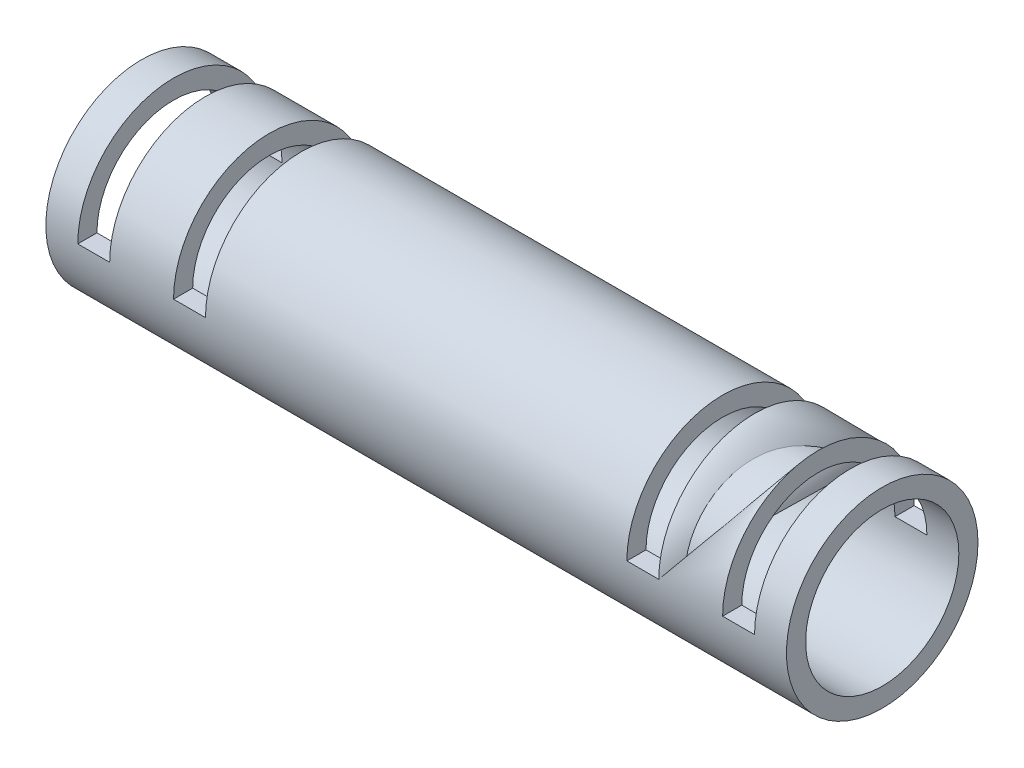
ISO-10303-21;
HEADER;
FILE_DESCRIPTION(('STEP AP214'),'2;1');
FILE_NAME('part.step','',(''),(''),'','','');
FILE_SCHEMA(('AUTOMOTIVE_DESIGN { 1 0 10303 214 1 1 1 1 }'));
ENDSEC;
DATA;
#1=APPLICATION_CONTEXT('core data for automotive mechanical design processes');
#2=APPLICATION_PROTOCOL_DEFINITION('international standard','automotive_design',2000,#1);
#3=PRODUCT_CONTEXT('',#1,'mechanical');
#4=PRODUCT('Part','Part','',(#3));
#5=PRODUCT_RELATED_PRODUCT_CATEGORY('part','',(#4));
#6=PRODUCT_DEFINITION_FORMATION('','',#4);
#7=PRODUCT_DEFINITION_CONTEXT('part definition',#1,'design');
#8=PRODUCT_DEFINITION('design','',#6,#7);
#9=PRODUCT_DEFINITION_SHAPE('','',#8);
#10=(LENGTH_UNIT() NAMED_UNIT(*) SI_UNIT(.MILLI.,.METRE.));
#11=(NAMED_UNIT(*) PLANE_ANGLE_UNIT() SI_UNIT($,.RADIAN.));
#12=(NAMED_UNIT(*) SI_UNIT($,.STERADIAN.) SOLID_ANGLE_UNIT());
#13=UNCERTAINTY_MEASURE_WITH_UNIT(LENGTH_MEASURE(1.E-05),#10,'distance_accuracy_value','');
#14=(GEOMETRIC_REPRESENTATION_CONTEXT(3) GLOBAL_UNCERTAINTY_ASSIGNED_CONTEXT((#13)) GLOBAL_UNIT_ASSIGNED_CONTEXT((#10,
#11,#12)) REPRESENTATION_CONTEXT('',''));
#15=CARTESIAN_POINT('',(0.,0.,0.));
#16=DIRECTION('',(0.,0.,1.));
#17=DIRECTION('',(1.,0.,0.));
#18=AXIS2_PLACEMENT_3D('',#15,#16,#17);
#19=CARTESIAN_POINT('',(29.,0.,0.));
#20=DIRECTION('',(-1.,0.,0.));
#21=DIRECTION('',(0.,0.,1.));
#22=AXIS2_PLACEMENT_3D('',#19,#20,#21);
#23=CYLINDRICAL_SURFACE('',#22,7.5);
#24=CARTESIAN_POINT('',(26.5,0.,0.));
#25=DIRECTION('',(-1.,0.,0.));
#26=DIRECTION('',(0.,0.,1.));
#27=AXIS2_PLACEMENT_3D('',#24,#25,#26);
#28=CIRCLE('',#27,7.5);
#29=CARTESIAN_POINT('',(26.5,0.,-7.5));
#30=VERTEX_POINT('',#29);
#31=CARTESIAN_POINT('',(26.5,0.,7.5));
#32=VERTEX_POINT('',#31);
#33=EDGE_CURVE('E56',#30,#32,#28,.F.);
#34=ORIENTED_EDGE('',*,*,#33,.T.);
#35=DIRECTION('',(1.,0.,0.));
#36=VECTOR('',#35,1.);
#37=CARTESIAN_POINT('',(26.5,0.,7.5));
#38=LINE('',#37,#36);
#39=CARTESIAN_POINT('',(24.,0.,7.5));
#40=VERTEX_POINT('',#39);
#41=EDGE_CURVE('E166',#40,#32,#38,.T.);
#42=ORIENTED_EDGE('',*,*,#41,.F.);
#43=CARTESIAN_POINT('',(24.,0.,0.));
#44=DIRECTION('',(1.,0.,0.));
#45=DIRECTION('',(0.,0.,-1.));
#46=AXIS2_PLACEMENT_3D('',#43,#44,#45);
#47=CIRCLE('',#46,7.5);
#48=CARTESIAN_POINT('',(24.,0.,-7.5));
#49=VERTEX_POINT('',#48);
#50=EDGE_CURVE('E178',#40,#49,#47,.F.);
#51=ORIENTED_EDGE('',*,*,#50,.T.);
#52=DIRECTION('',(-1.,0.,0.));
#53=VECTOR('',#52,1.);
#54=CARTESIAN_POINT('',(26.5,0.,-7.5));
#55=LINE('',#54,#53);
#56=EDGE_CURVE('E191',#30,#49,#55,.T.);
#57=ORIENTED_EDGE('',*,*,#56,.F.);
#58=EDGE_LOOP('',(#34,#42,#51,#57));
#59=FACE_BOUND('',#58,.T.);
#60=CARTESIAN_POINT('',(-29.,0.,0.));
#61=DIRECTION('',(1.,0.,0.));
#62=DIRECTION('',(0.,0.,-1.));
#63=AXIS2_PLACEMENT_3D('',#60,#61,#62);
#64=CIRCLE('',#63,7.5);
#65=CARTESIAN_POINT('',(-29.,0.,-7.5));
#66=VERTEX_POINT('',#65);
#67=EDGE_CURVE('E44',#66,#66,#64,.T.);
#68=ORIENTED_EDGE('',*,*,#67,.T.);
#69=EDGE_LOOP('',(#68));
#70=FACE_BOUND('',#69,.T.);
#71=CARTESIAN_POINT('',(29.,0.,0.));
#72=DIRECTION('',(1.,0.,0.));
#73=DIRECTION('',(0.,0.,-1.));
#74=AXIS2_PLACEMENT_3D('',#71,#72,#73);
#75=CIRCLE('',#74,7.5);
#76=CARTESIAN_POINT('',(29.,0.,-7.5));
#77=VERTEX_POINT('',#76);
#78=EDGE_CURVE('E11',#77,#77,#75,.T.);
#79=ORIENTED_EDGE('',*,*,#78,.F.);
#80=EDGE_LOOP('',(#79));
#81=FACE_BOUND('',#80,.T.);
#82=CARTESIAN_POINT('',(-24.,0.,0.));
#83=DIRECTION('',(-1.,0.,0.));
#84=DIRECTION('',(0.,0.,1.));
#85=AXIS2_PLACEMENT_3D('',#82,#83,#84);
#86=CIRCLE('',#85,7.5);
#87=CARTESIAN_POINT('',(-24.,0.,-7.5));
#88=VERTEX_POINT('',#87);
#89=CARTESIAN_POINT('',(-24.,0.,7.50000000000001));
#90=VERTEX_POINT('',#89);
#91=EDGE_CURVE('E288',#88,#90,#86,.F.);
#92=ORIENTED_EDGE('',*,*,#91,.T.);
#93=DIRECTION('',(1.,0.,0.));
#94=VECTOR('',#93,1.);
#95=CARTESIAN_POINT('',(-26.5,0.,7.50000000000001));
#96=LINE('',#95,#94);
#97=CARTESIAN_POINT('',(-26.5,0.,7.50000000000001));
#98=VERTEX_POINT('',#97);
#99=EDGE_CURVE('E304',#98,#90,#96,.T.);
#100=ORIENTED_EDGE('',*,*,#99,.F.);
#101=CARTESIAN_POINT('',(-26.5,0.,0.));
#102=DIRECTION('',(1.,0.,0.));
#103=DIRECTION('',(0.,0.,-1.));
#104=AXIS2_PLACEMENT_3D('',#101,#102,#103);
#105=CIRCLE('',#104,7.5);
#106=CARTESIAN_POINT('',(-26.5,0.,-7.5));
#107=VERTEX_POINT('',#106);
#108=EDGE_CURVE('E292',#98,#107,#105,.F.);
#109=ORIENTED_EDGE('',*,*,#108,.T.);
#110=DIRECTION('',(-1.,0.,0.));
#111=VECTOR('',#110,1.);
#112=CARTESIAN_POINT('',(-26.5,0.,-7.49999999999999));
#113=LINE('',#112,#111);
#114=EDGE_CURVE('E296',#88,#107,#113,.T.);
#115=ORIENTED_EDGE('',*,*,#114,.F.);
#116=EDGE_LOOP('',(#92,#100,#109,#115));
#117=FACE_BOUND('',#116,.T.);
#118=CARTESIAN_POINT('',(19.,0.,0.));
#119=DIRECTION('',(-1.,0.,0.));
#120=DIRECTION('',(0.,0.,1.));
#121=AXIS2_PLACEMENT_3D('',#118,#119,#120);
#122=CIRCLE('',#121,7.5);
#123=CARTESIAN_POINT('',(19.,0.,-7.5));
#124=VERTEX_POINT('',#123);
#125=CARTESIAN_POINT('',(19.,0.,7.50000000000005));
#126=VERTEX_POINT('',#125);
#127=EDGE_CURVE('E253',#124,#126,#122,.F.);
#128=ORIENTED_EDGE('',*,*,#127,.T.);
#129=DIRECTION('',(1.,0.,0.));
#130=VECTOR('',#129,1.);
#131=CARTESIAN_POINT('',(19.,0.,7.50000000000005));
#132=LINE('',#131,#130);
#133=CARTESIAN_POINT('',(16.5,0.,7.50000000000005));
#134=VERTEX_POINT('',#133);
#135=EDGE_CURVE('E270',#134,#126,#132,.T.);
#136=ORIENTED_EDGE('',*,*,#135,.F.);
#137=CARTESIAN_POINT('',(16.5,0.,0.));
#138=DIRECTION('',(1.,0.,0.));
#139=DIRECTION('',(0.,0.,-1.));
#140=AXIS2_PLACEMENT_3D('',#137,#138,#139);
#141=CIRCLE('',#140,7.5);
#142=CARTESIAN_POINT('',(16.5,0.,-7.5));
#143=VERTEX_POINT('',#142);
#144=EDGE_CURVE('E249',#134,#143,#141,.F.);
#145=ORIENTED_EDGE('',*,*,#144,.T.);
#146=DIRECTION('',(-1.,0.,0.));
#147=VECTOR('',#146,1.);
#148=CARTESIAN_POINT('',(19.,0.,-7.49999999999995));
#149=LINE('',#148,#147);
#150=EDGE_CURVE('E262',#124,#143,#149,.T.);
#151=ORIENTED_EDGE('',*,*,#150,.F.);
#152=EDGE_LOOP('',(#128,#136,#145,#151));
#153=FACE_BOUND('',#152,.T.);
#154=DIRECTION('',(-1.,0.,0.));
#155=VECTOR('',#154,1.);
#156=CARTESIAN_POINT('',(-19.,0.,-7.49999999999994));
#157=LINE('',#156,#155);
#158=CARTESIAN_POINT('',(-16.5,0.,-7.49999999999994));
#159=VERTEX_POINT('',#158);
#160=CARTESIAN_POINT('',(-19.,0.,-7.49999999999994));
#161=VERTEX_POINT('',#160);
#162=EDGE_CURVE('E230',#159,#161,#157,.T.);
#163=ORIENTED_EDGE('',*,*,#162,.F.);
#164=CARTESIAN_POINT('',(-16.5,0.,0.));
#165=DIRECTION('',(-1.,0.,0.));
#166=DIRECTION('',(0.,0.,1.));
#167=AXIS2_PLACEMENT_3D('',#164,#165,#166);
#168=CIRCLE('',#167,7.5);
#169=CARTESIAN_POINT('',(-16.5,0.,7.5));
#170=VERTEX_POINT('',#169);
#171=EDGE_CURVE('E211',#159,#170,#168,.F.);
#172=ORIENTED_EDGE('',*,*,#171,.T.);
#173=DIRECTION('',(1.,0.,0.));
#174=VECTOR('',#173,1.);
#175=CARTESIAN_POINT('',(-19.,0.,7.50000000000006));
#176=LINE('',#175,#174);
#177=CARTESIAN_POINT('',(-19.,0.,7.5));
#178=VERTEX_POINT('',#177);
#179=EDGE_CURVE('E221',#178,#170,#176,.T.);
#180=ORIENTED_EDGE('',*,*,#179,.F.);
#181=CARTESIAN_POINT('',(-19.,0.,0.));
#182=DIRECTION('',(1.,0.,0.));
#183=DIRECTION('',(0.,0.,-1.));
#184=AXIS2_PLACEMENT_3D('',#181,#182,#183);
#185=CIRCLE('',#184,7.5);
#186=EDGE_CURVE('E64',#178,#161,#185,.F.);
#187=ORIENTED_EDGE('',*,*,#186,.T.);
#188=EDGE_LOOP('',(#163,#172,#180,#187));
#189=FACE_BOUND('',#188,.T.);
#190=ADVANCED_FACE('F41',(#59,#70,#81,#117,#153,#189),#23,.T.);
#191=CARTESIAN_POINT('',(29.,0.,0.));
#192=DIRECTION('',(-1.,0.,0.));
#193=DIRECTION('',(0.,0.,1.));
#194=AXIS2_PLACEMENT_3D('',#191,#192,#193);
#195=CYLINDRICAL_SURFACE('',#194,6.);
#196=DIRECTION('',(-1.,0.,0.));
#197=VECTOR('',#196,1.);
#198=CARTESIAN_POINT('',(29.,0.,6.));
#199=LINE('',#198,#197);
#200=CARTESIAN_POINT('',(24.,0.,6.));
#201=VERTEX_POINT('',#200);
#202=CARTESIAN_POINT('',(26.5,0.,6.));
#203=VERTEX_POINT('',#202);
#204=EDGE_CURVE('E165',#201,#203,#199,.F.);
#205=ORIENTED_EDGE('',*,*,#204,.T.);
#206=CARTESIAN_POINT('',(26.5,0.,0.));
#207=DIRECTION('',(-1.,0.,0.));
#208=DIRECTION('',(0.,0.,1.));
#209=AXIS2_PLACEMENT_3D('',#206,#207,#208);
#210=CIRCLE('',#209,6.);
#211=CARTESIAN_POINT('',(26.5,0.,-6.));
#212=VERTEX_POINT('',#211);
#213=EDGE_CURVE('E169',#212,#203,#210,.F.);
#214=ORIENTED_EDGE('',*,*,#213,.F.);
#215=DIRECTION('',(-1.,0.,0.));
#216=VECTOR('',#215,1.);
#217=CARTESIAN_POINT('',(29.,0.,-6.));
#218=LINE('',#217,#216);
#219=CARTESIAN_POINT('',(24.,0.,-6.));
#220=VERTEX_POINT('',#219);
#221=EDGE_CURVE('E154',#212,#220,#218,.T.);
#222=ORIENTED_EDGE('',*,*,#221,.T.);
#223=CARTESIAN_POINT('',(24.,0.,0.));
#224=DIRECTION('',(1.,0.,0.));
#225=DIRECTION('',(0.,0.,-1.));
#226=AXIS2_PLACEMENT_3D('',#223,#224,#225);
#227=CIRCLE('',#226,6.);
#228=EDGE_CURVE('E179',#201,#220,#227,.F.);
#229=ORIENTED_EDGE('',*,*,#228,.F.);
#230=EDGE_LOOP('',(#205,#214,#222,#229));
#231=FACE_BOUND('',#230,.T.);
#232=DIRECTION('',(-1.,0.,0.));
#233=VECTOR('',#232,1.);
#234=CARTESIAN_POINT('',(29.,0.,6.));
#235=LINE('',#234,#233);
#236=CARTESIAN_POINT('',(16.5,0.,6.));
#237=VERTEX_POINT('',#236);
#238=CARTESIAN_POINT('',(19.,0.,6.));
#239=VERTEX_POINT('',#238);
#240=EDGE_CURVE('E207',#237,#239,#235,.F.);
#241=ORIENTED_EDGE('',*,*,#240,.T.);
#242=CARTESIAN_POINT('',(19.,0.,0.));
#243=DIRECTION('',(-1.,0.,0.));
#244=DIRECTION('',(0.,0.,1.));
#245=AXIS2_PLACEMENT_3D('',#242,#243,#244);
#246=CIRCLE('',#245,6.);
#247=CARTESIAN_POINT('',(19.,0.,-6.));
#248=VERTEX_POINT('',#247);
#249=EDGE_CURVE('E245',#248,#239,#246,.F.);
#250=ORIENTED_EDGE('',*,*,#249,.F.);
#251=DIRECTION('',(-1.,0.,0.));
#252=VECTOR('',#251,1.);
#253=CARTESIAN_POINT('',(29.,0.,-6.));
#254=LINE('',#253,#252);
#255=CARTESIAN_POINT('',(16.5,0.,-6.));
#256=VERTEX_POINT('',#255);
#257=EDGE_CURVE('E274',#248,#256,#254,.T.);
#258=ORIENTED_EDGE('',*,*,#257,.T.);
#259=CARTESIAN_POINT('',(16.5,0.,0.));
#260=DIRECTION('',(1.,0.,0.));
#261=DIRECTION('',(0.,0.,-1.));
#262=AXIS2_PLACEMENT_3D('',#259,#260,#261);
#263=CIRCLE('',#262,6.);
#264=EDGE_CURVE('E241',#237,#256,#263,.F.);
#265=ORIENTED_EDGE('',*,*,#264,.F.);
#266=EDGE_LOOP('',(#241,#250,#258,#265));
#267=FACE_BOUND('',#266,.T.);
#268=DIRECTION('',(-1.,0.,0.));
#269=VECTOR('',#268,1.);
#270=CARTESIAN_POINT('',(29.,0.,6.));
#271=LINE('',#270,#269);
#272=CARTESIAN_POINT('',(-26.5,0.,6.));
#273=VERTEX_POINT('',#272);
#274=CARTESIAN_POINT('',(-24.,0.,6.));
#275=VERTEX_POINT('',#274);
#276=EDGE_CURVE('E246',#273,#275,#271,.F.);
#277=ORIENTED_EDGE('',*,*,#276,.T.);
#278=CARTESIAN_POINT('',(-24.,0.,0.));
#279=DIRECTION('',(-1.,0.,0.));
#280=DIRECTION('',(0.,0.,1.));
#281=AXIS2_PLACEMENT_3D('',#278,#279,#280);
#282=CIRCLE('',#281,6.);
#283=CARTESIAN_POINT('',(-24.,0.,-6.));
#284=VERTEX_POINT('',#283);
#285=EDGE_CURVE('E281',#284,#275,#282,.F.);
#286=ORIENTED_EDGE('',*,*,#285,.F.);
#287=DIRECTION('',(-1.,0.,0.));
#288=VECTOR('',#287,1.);
#289=CARTESIAN_POINT('',(29.,0.,-6.));
#290=LINE('',#289,#288);
#291=CARTESIAN_POINT('',(-26.5,0.,-6.));
#292=VERTEX_POINT('',#291);
#293=EDGE_CURVE('E313',#284,#292,#290,.T.);
#294=ORIENTED_EDGE('',*,*,#293,.T.);
#295=CARTESIAN_POINT('',(-26.5,0.,0.));
#296=DIRECTION('',(1.,0.,0.));
#297=DIRECTION('',(0.,0.,-1.));
#298=AXIS2_PLACEMENT_3D('',#295,#296,#297);
#299=CIRCLE('',#298,6.);
#300=EDGE_CURVE('E284',#273,#292,#299,.F.);
#301=ORIENTED_EDGE('',*,*,#300,.F.);
#302=EDGE_LOOP('',(#277,#286,#294,#301));
#303=FACE_BOUND('',#302,.T.);
#304=CARTESIAN_POINT('',(29.,0.,0.));
#305=DIRECTION('',(1.,0.,0.));
#306=DIRECTION('',(0.,0.,-1.));
#307=AXIS2_PLACEMENT_3D('',#304,#305,#306);
#308=CIRCLE('',#307,6.);
#309=CARTESIAN_POINT('',(29.,0.,-6.));
#310=VERTEX_POINT('',#309);
#311=EDGE_CURVE('E320',#310,#310,#308,.T.);
#312=ORIENTED_EDGE('',*,*,#311,.T.);
#313=EDGE_LOOP('',(#312));
#314=FACE_BOUND('',#313,.T.);
#315=CARTESIAN_POINT('',(-29.,0.,0.));
#316=DIRECTION('',(1.,0.,0.));
#317=DIRECTION('',(0.,0.,-1.));
#318=AXIS2_PLACEMENT_3D('',#315,#316,#317);
#319=CIRCLE('',#318,6.);
#320=CARTESIAN_POINT('',(-29.,0.,-6.));
#321=VERTEX_POINT('',#320);
#322=EDGE_CURVE('E202',#321,#321,#319,.T.);
#323=ORIENTED_EDGE('',*,*,#322,.F.);
#324=EDGE_LOOP('',(#323));
#325=FACE_BOUND('',#324,.T.);
#326=CARTESIAN_POINT('',(-16.5,0.,0.));
#327=DIRECTION('',(-1.,0.,0.));
#328=DIRECTION('',(0.,0.,1.));
#329=AXIS2_PLACEMENT_3D('',#326,#327,#328);
#330=CIRCLE('',#329,6.);
#331=CARTESIAN_POINT('',(-16.5,0.,-6.));
#332=VERTEX_POINT('',#331);
#333=CARTESIAN_POINT('',(-16.5,0.,6.));
#334=VERTEX_POINT('',#333);
#335=EDGE_CURVE('E203',#332,#334,#330,.F.);
#336=ORIENTED_EDGE('',*,*,#335,.F.);
#337=DIRECTION('',(-1.,0.,0.));
#338=VECTOR('',#337,1.);
#339=CARTESIAN_POINT('',(29.,0.,-6.));
#340=LINE('',#339,#338);
#341=CARTESIAN_POINT('',(-19.,0.,-6.));
#342=VERTEX_POINT('',#341);
#343=EDGE_CURVE('E185',#342,#332,#340,.F.);
#344=ORIENTED_EDGE('',*,*,#343,.F.);
#345=CARTESIAN_POINT('',(-19.,0.,0.));
#346=DIRECTION('',(1.,0.,0.));
#347=DIRECTION('',(0.,0.,-1.));
#348=AXIS2_PLACEMENT_3D('',#345,#346,#347);
#349=CIRCLE('',#348,6.);
#350=CARTESIAN_POINT('',(-19.,0.,6.));
#351=VERTEX_POINT('',#350);
#352=EDGE_CURVE('E206',#351,#342,#349,.F.);
#353=ORIENTED_EDGE('',*,*,#352,.F.);
#354=DIRECTION('',(-1.,0.,0.));
#355=VECTOR('',#354,1.);
#356=CARTESIAN_POINT('',(29.,0.,6.));
#357=LINE('',#356,#355);
#358=EDGE_CURVE('E234',#334,#351,#357,.T.);
#359=ORIENTED_EDGE('',*,*,#358,.F.);
#360=EDGE_LOOP('',(#336,#344,#353,#359));
#361=FACE_BOUND('',#360,.T.);
#362=ADVANCED_FACE('F175',(#231,#267,#303,#314,#325,#361),#195,.F.);
#363=CARTESIAN_POINT('',(29.,0.,0.));
#364=DIRECTION('',(1.,0.,0.));
#365=DIRECTION('',(0.,0.,-1.));
#366=AXIS2_PLACEMENT_3D('',#363,#364,#365);
#367=PLANE('',#366);
#368=ORIENTED_EDGE('',*,*,#78,.T.);
#369=EDGE_LOOP('',(#368));
#370=FACE_BOUND('',#369,.T.);
#371=ORIENTED_EDGE('',*,*,#311,.F.);
#372=EDGE_LOOP('',(#371));
#373=FACE_BOUND('',#372,.T.);
#374=ADVANCED_FACE('F332',(#370,#373),#367,.T.);
#375=CARTESIAN_POINT('',(-29.,0.,0.));
#376=DIRECTION('',(1.,0.,0.));
#377=DIRECTION('',(0.,0.,-1.));
#378=AXIS2_PLACEMENT_3D('',#375,#376,#377);
#379=PLANE('',#378);
#380=ORIENTED_EDGE('',*,*,#67,.F.);
#381=EDGE_LOOP('',(#380));
#382=FACE_BOUND('',#381,.T.);
#383=ORIENTED_EDGE('',*,*,#322,.T.);
#384=EDGE_LOOP('',(#383));
#385=FACE_BOUND('',#384,.T.);
#386=ADVANCED_FACE('F328',(#382,#385),#379,.F.);
#387=CARTESIAN_POINT('',(-26.5,7.501,-7.49999999999999));
#388=DIRECTION('',(1.,0.,0.));
#389=DIRECTION('',(0.,0.,-1.));
#390=AXIS2_PLACEMENT_3D('',#387,#388,#389);
#391=PLANE('',#390);
#392=DIRECTION('',(0.,0.,1.));
#393=VECTOR('',#392,1.);
#394=CARTESIAN_POINT('',(-26.5,0.,-7.49999999999999));
#395=LINE('',#394,#393);
#396=EDGE_CURVE('E300',#273,#98,#395,.T.);
#397=ORIENTED_EDGE('',*,*,#396,.F.);
#398=ORIENTED_EDGE('',*,*,#300,.T.);
#399=EDGE_CURVE('E301',#107,#292,#395,.T.);
#400=ORIENTED_EDGE('',*,*,#399,.F.);
#401=ORIENTED_EDGE('',*,*,#108,.F.);
#402=EDGE_LOOP('',(#397,#398,#400,#401));
#403=FACE_BOUND('',#402,.T.);
#404=ADVANCED_FACE('F363',(#403),#391,.T.);
#405=CARTESIAN_POINT('',(-24.,7.501,-7.49999999999999));
#406=DIRECTION('',(-1.,0.,0.));
#407=DIRECTION('',(0.,0.,1.));
#408=AXIS2_PLACEMENT_3D('',#405,#406,#407);
#409=PLANE('',#408);
#410=DIRECTION('',(0.,0.,-1.));
#411=VECTOR('',#410,1.);
#412=CARTESIAN_POINT('',(-24.,0.,-7.49999999999999));
#413=LINE('',#412,#411);
#414=EDGE_CURVE('E308',#284,#88,#413,.T.);
#415=ORIENTED_EDGE('',*,*,#414,.F.);
#416=ORIENTED_EDGE('',*,*,#285,.T.);
#417=EDGE_CURVE('E309',#90,#275,#413,.T.);
#418=ORIENTED_EDGE('',*,*,#417,.F.);
#419=ORIENTED_EDGE('',*,*,#91,.F.);
#420=EDGE_LOOP('',(#415,#416,#418,#419));
#421=FACE_BOUND('',#420,.T.);
#422=ADVANCED_FACE('F369',(#421),#409,.T.);
#423=CARTESIAN_POINT('',(0.,0.,0.));
#424=DIRECTION('',(0.,-1.,0.));
#425=DIRECTION('',(0.,0.,-1.));
#426=AXIS2_PLACEMENT_3D('',#423,#424,#425);
#427=PLANE('',#426);
#428=ORIENTED_EDGE('',*,*,#396,.T.);
#429=ORIENTED_EDGE('',*,*,#99,.T.);
#430=ORIENTED_EDGE('',*,*,#417,.T.);
#431=ORIENTED_EDGE('',*,*,#276,.F.);
#432=EDGE_LOOP('',(#428,#429,#430,#431));
#433=FACE_BOUND('',#432,.T.);
#434=ADVANCED_FACE('F359',(#433),#427,.F.);
#435=ORIENTED_EDGE('',*,*,#414,.T.);
#436=ORIENTED_EDGE('',*,*,#114,.T.);
#437=ORIENTED_EDGE('',*,*,#399,.T.);
#438=ORIENTED_EDGE('',*,*,#293,.F.);
#439=EDGE_LOOP('',(#435,#436,#437,#438));
#440=FACE_BOUND('',#439,.T.);
#441=ADVANCED_FACE('F372',(#440),#427,.F.);
#442=CARTESIAN_POINT('',(19.,7.501,-7.49999999999995));
#443=DIRECTION('',(-1.,0.,0.));
#444=DIRECTION('',(0.,0.,1.));
#445=AXIS2_PLACEMENT_3D('',#442,#443,#444);
#446=PLANE('',#445);
#447=DIRECTION('',(0.,0.,-1.));
#448=VECTOR('',#447,1.);
#449=CARTESIAN_POINT('',(19.,0.,-7.49999999999995));
#450=LINE('',#449,#448);
#451=EDGE_CURVE('E257',#248,#124,#450,.T.);
#452=ORIENTED_EDGE('',*,*,#451,.F.);
#453=ORIENTED_EDGE('',*,*,#249,.T.);
#454=EDGE_CURVE('E258',#126,#239,#450,.T.);
#455=ORIENTED_EDGE('',*,*,#454,.F.);
#456=ORIENTED_EDGE('',*,*,#127,.F.);
#457=EDGE_LOOP('',(#452,#453,#455,#456));
#458=FACE_BOUND('',#457,.T.);
#459=ADVANCED_FACE('F427',(#458),#446,.T.);
#460=CARTESIAN_POINT('',(16.5,7.501,-7.49999999999995));
#461=DIRECTION('',(1.,0.,0.));
#462=DIRECTION('',(0.,0.,-1.));
#463=AXIS2_PLACEMENT_3D('',#460,#461,#462);
#464=PLANE('',#463);
#465=DIRECTION('',(0.,0.,1.));
#466=VECTOR('',#465,1.);
#467=CARTESIAN_POINT('',(16.5,0.,-7.49999999999995));
#468=LINE('',#467,#466);
#469=EDGE_CURVE('E266',#237,#134,#468,.T.);
#470=ORIENTED_EDGE('',*,*,#469,.F.);
#471=ORIENTED_EDGE('',*,*,#264,.T.);
#472=EDGE_CURVE('E267',#143,#256,#468,.T.);
#473=ORIENTED_EDGE('',*,*,#472,.F.);
#474=ORIENTED_EDGE('',*,*,#144,.F.);
#475=EDGE_LOOP('',(#470,#471,#473,#474));
#476=FACE_BOUND('',#475,.T.);
#477=ADVANCED_FACE('F424',(#476),#464,.T.);
#478=CARTESIAN_POINT('',(0.,0.,0.));
#479=DIRECTION('',(0.,-1.,0.));
#480=DIRECTION('',(0.,0.,-1.));
#481=AXIS2_PLACEMENT_3D('',#478,#479,#480);
#482=PLANE('',#481);
#483=ORIENTED_EDGE('',*,*,#469,.T.);
#484=ORIENTED_EDGE('',*,*,#135,.T.);
#485=ORIENTED_EDGE('',*,*,#454,.T.);
#486=ORIENTED_EDGE('',*,*,#240,.F.);
#487=EDGE_LOOP('',(#483,#484,#485,#486));
#488=FACE_BOUND('',#487,.T.);
#489=ADVANCED_FACE('F422',(#488),#482,.F.);
#490=ORIENTED_EDGE('',*,*,#451,.T.);
#491=ORIENTED_EDGE('',*,*,#150,.T.);
#492=ORIENTED_EDGE('',*,*,#472,.T.);
#493=ORIENTED_EDGE('',*,*,#257,.F.);
#494=EDGE_LOOP('',(#490,#491,#492,#493));
#495=FACE_BOUND('',#494,.T.);
#496=ADVANCED_FACE('F419',(#495),#482,.F.);
#497=CARTESIAN_POINT('',(-19.,7.501,-7.49999999999994));
#498=DIRECTION('',(1.,0.,0.));
#499=DIRECTION('',(0.,0.,-1.));
#500=AXIS2_PLACEMENT_3D('',#497,#498,#499);
#501=PLANE('',#500);
#502=DIRECTION('',(0.,0.,1.));
#503=VECTOR('',#502,1.);
#504=CARTESIAN_POINT('',(-19.,0.,-7.49999999999994));
#505=LINE('',#504,#503);
#506=EDGE_CURVE('E217',#351,#178,#505,.T.);
#507=ORIENTED_EDGE('',*,*,#506,.F.);
#508=ORIENTED_EDGE('',*,*,#352,.T.);
#509=EDGE_CURVE('E218',#161,#342,#505,.T.);
#510=ORIENTED_EDGE('',*,*,#509,.F.);
#511=ORIENTED_EDGE('',*,*,#186,.F.);
#512=EDGE_LOOP('',(#507,#508,#510,#511));
#513=FACE_BOUND('',#512,.T.);
#514=ADVANCED_FACE('F416',(#513),#501,.T.);
#515=CARTESIAN_POINT('',(-16.5,7.501,-7.49999999999994));
#516=DIRECTION('',(-1.,0.,0.));
#517=DIRECTION('',(0.,0.,1.));
#518=AXIS2_PLACEMENT_3D('',#515,#516,#517);
#519=PLANE('',#518);
#520=DIRECTION('',(0.,0.,-1.));
#521=VECTOR('',#520,1.);
#522=CARTESIAN_POINT('',(-16.5,0.,-7.49999999999994));
#523=LINE('',#522,#521);
#524=EDGE_CURVE('E225',#332,#159,#523,.T.);
#525=ORIENTED_EDGE('',*,*,#524,.F.);
#526=ORIENTED_EDGE('',*,*,#335,.T.);
#527=EDGE_CURVE('E226',#170,#334,#523,.T.);
#528=ORIENTED_EDGE('',*,*,#527,.F.);
#529=ORIENTED_EDGE('',*,*,#171,.F.);
#530=EDGE_LOOP('',(#525,#526,#528,#529));
#531=FACE_BOUND('',#530,.T.);
#532=ADVANCED_FACE('F339',(#531),#519,.T.);
#533=CARTESIAN_POINT('',(0.,0.,0.));
#534=DIRECTION('',(0.,1.,0.));
#535=DIRECTION('',(0.,0.,1.));
#536=AXIS2_PLACEMENT_3D('',#533,#534,#535);
#537=PLANE('',#536);
#538=ORIENTED_EDGE('',*,*,#343,.T.);
#539=ORIENTED_EDGE('',*,*,#524,.T.);
#540=ORIENTED_EDGE('',*,*,#162,.T.);
#541=ORIENTED_EDGE('',*,*,#509,.T.);
#542=EDGE_LOOP('',(#538,#539,#540,#541));
#543=FACE_BOUND('',#542,.T.);
#544=ADVANCED_FACE('F347',(#543),#537,.T.);
#545=ORIENTED_EDGE('',*,*,#358,.T.);
#546=ORIENTED_EDGE('',*,*,#506,.T.);
#547=ORIENTED_EDGE('',*,*,#179,.T.);
#548=ORIENTED_EDGE('',*,*,#527,.T.);
#549=EDGE_LOOP('',(#545,#546,#547,#548));
#550=FACE_BOUND('',#549,.T.);
#551=ADVANCED_FACE('F342',(#550),#537,.T.);
#552=CARTESIAN_POINT('',(26.5,7.501,-7.5));
#553=DIRECTION('',(-1.,0.,0.));
#554=DIRECTION('',(0.,0.,1.));
#555=AXIS2_PLACEMENT_3D('',#552,#553,#554);
#556=PLANE('',#555);
#557=DIRECTION('',(0.,0.,-1.));
#558=VECTOR('',#557,1.);
#559=CARTESIAN_POINT('',(26.5,0.,-7.5));
#560=LINE('',#559,#558);
#561=EDGE_CURVE('E157',#212,#30,#560,.T.);
#562=ORIENTED_EDGE('',*,*,#561,.F.);
#563=ORIENTED_EDGE('',*,*,#213,.T.);
#564=EDGE_CURVE('E172',#32,#203,#560,.T.);
#565=ORIENTED_EDGE('',*,*,#564,.F.);
#566=ORIENTED_EDGE('',*,*,#33,.F.);
#567=EDGE_LOOP('',(#562,#563,#565,#566));
#568=FACE_BOUND('',#567,.T.);
#569=ADVANCED_FACE('F168',(#568),#556,.T.);
#570=CARTESIAN_POINT('',(24.,7.501,-7.5));
#571=DIRECTION('',(1.,0.,0.));
#572=DIRECTION('',(0.,0.,-1.));
#573=AXIS2_PLACEMENT_3D('',#570,#571,#572);
#574=PLANE('',#573);
#575=DIRECTION('',(0.,0.,1.));
#576=VECTOR('',#575,1.);
#577=CARTESIAN_POINT('',(24.,0.,-7.5));
#578=LINE('',#577,#576);
#579=EDGE_CURVE('E194',#201,#40,#578,.T.);
#580=ORIENTED_EDGE('',*,*,#579,.F.);
#581=ORIENTED_EDGE('',*,*,#228,.T.);
#582=EDGE_CURVE('E159',#49,#220,#578,.T.);
#583=ORIENTED_EDGE('',*,*,#582,.F.);
#584=ORIENTED_EDGE('',*,*,#50,.F.);
#585=EDGE_LOOP('',(#580,#581,#583,#584));
#586=FACE_BOUND('',#585,.T.);
#587=ADVANCED_FACE('F398',(#586),#574,.T.);
#588=CARTESIAN_POINT('',(0.,0.,0.));
#589=DIRECTION('',(0.,-1.,0.));
#590=DIRECTION('',(0.,0.,-1.));
#591=AXIS2_PLACEMENT_3D('',#588,#589,#590);
#592=PLANE('',#591);
#593=ORIENTED_EDGE('',*,*,#579,.T.);
#594=ORIENTED_EDGE('',*,*,#41,.T.);
#595=ORIENTED_EDGE('',*,*,#564,.T.);
#596=ORIENTED_EDGE('',*,*,#204,.F.);
#597=EDGE_LOOP('',(#593,#594,#595,#596));
#598=FACE_BOUND('',#597,.T.);
#599=ADVANCED_FACE('F401',(#598),#592,.F.);
#600=ORIENTED_EDGE('',*,*,#561,.T.);
#601=ORIENTED_EDGE('',*,*,#56,.T.);
#602=ORIENTED_EDGE('',*,*,#582,.T.);
#603=ORIENTED_EDGE('',*,*,#221,.F.);
#604=EDGE_LOOP('',(#600,#601,#602,#603));
#605=FACE_BOUND('',#604,.T.);
#606=ADVANCED_FACE('F155',(#605),#592,.F.);
#607=CLOSED_SHELL('',(#190,#362,#374,#386,#404,#422,#434,#441,#459,#477,#489,#496,#514,#532,
#544,#551,#569,#587,#599,#606));
#608=MANIFOLD_SOLID_BREP('B2',#607);
#609=ADVANCED_BREP_SHAPE_REPRESENTATION('',(#18,#608),#14);
#610=SHAPE_DEFINITION_REPRESENTATION(#9,#609);
ENDSEC;
END-ISO-10303-21;
